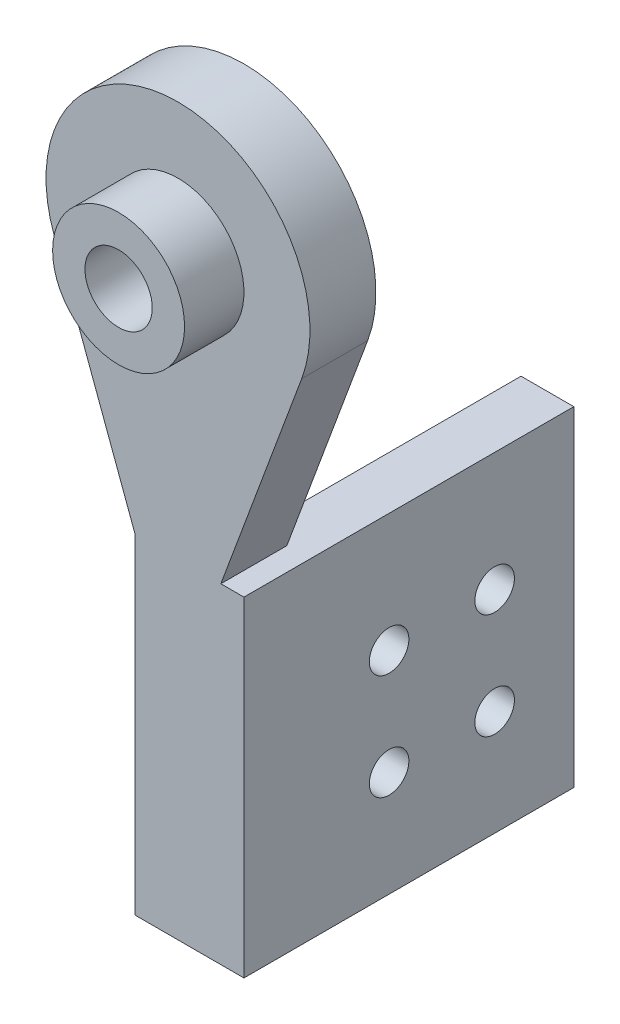
ISO-10303-21;
HEADER;
FILE_DESCRIPTION(('STEP AP214'),'2;1');
FILE_NAME('part.step','',(''),(''),'','','');
FILE_SCHEMA(('AUTOMOTIVE_DESIGN { 1 0 10303 214 1 1 1 1 }'));
ENDSEC;
DATA;
#1=APPLICATION_CONTEXT('core data for automotive mechanical design processes');
#2=APPLICATION_PROTOCOL_DEFINITION('international standard','automotive_design',2000,#1);
#3=PRODUCT_CONTEXT('',#1,'mechanical');
#4=PRODUCT('Part','Part','',(#3));
#5=PRODUCT_RELATED_PRODUCT_CATEGORY('part','',(#4));
#6=PRODUCT_DEFINITION_FORMATION('','',#4);
#7=PRODUCT_DEFINITION_CONTEXT('part definition',#1,'design');
#8=PRODUCT_DEFINITION('design','',#6,#7);
#9=PRODUCT_DEFINITION_SHAPE('','',#8);
#10=(LENGTH_UNIT() NAMED_UNIT(*) SI_UNIT(.MILLI.,.METRE.));
#11=(NAMED_UNIT(*) PLANE_ANGLE_UNIT() SI_UNIT($,.RADIAN.));
#12=(NAMED_UNIT(*) SI_UNIT($,.STERADIAN.) SOLID_ANGLE_UNIT());
#13=UNCERTAINTY_MEASURE_WITH_UNIT(LENGTH_MEASURE(1.E-05),#10,'distance_accuracy_value','');
#14=(GEOMETRIC_REPRESENTATION_CONTEXT(3) GLOBAL_UNCERTAINTY_ASSIGNED_CONTEXT((#13)) GLOBAL_UNIT_ASSIGNED_CONTEXT((#10,
#11,#12)) REPRESENTATION_CONTEXT('',''));
#15=CARTESIAN_POINT('',(0.,0.,0.));
#16=DIRECTION('',(0.,0.,1.));
#17=DIRECTION('',(1.,0.,0.));
#18=AXIS2_PLACEMENT_3D('',#15,#16,#17);
#19=CARTESIAN_POINT('',(0.,0.,5.));
#20=DIRECTION('',(0.,0.,-1.));
#21=DIRECTION('',(-1.,0.,0.));
#22=AXIS2_PLACEMENT_3D('',#19,#20,#21);
#23=PLANE('',#22);
#24=CARTESIAN_POINT('',(-0.331250810167493,32.3880005579145,5.));
#25=DIRECTION('',(0.,0.,-1.));
#26=DIRECTION('',(-1.,0.,0.));
#27=AXIS2_PLACEMENT_3D('',#24,#25,#26);
#28=CIRCLE('',#27,5.);
#29=CARTESIAN_POINT('',(-5.33125081016749,32.3880005579145,5.));
#30=VERTEX_POINT('',#29);
#31=EDGE_CURVE('E12',#30,#30,#28,.F.);
#32=ORIENTED_EDGE('',*,*,#31,.F.);
#33=EDGE_LOOP('',(#32));
#34=FACE_BOUND('',#33,.T.);
#35=DIRECTION('',(0.,1.,0.));
#36=VECTOR('',#35,1.);
#37=CARTESIAN_POINT('',(-3.58115134267295,12.3881145780887,5.));
#38=LINE('',#37,#36);
#39=CARTESIAN_POINT('',(-3.58115134267295,-12.6118854219113,5.));
#40=VERTEX_POINT('',#39);
#41=CARTESIAN_POINT('',(-3.58115134267295,12.3881145780887,5.));
#42=VERTEX_POINT('',#41);
#43=EDGE_CURVE('E141',#40,#42,#38,.T.);
#44=ORIENTED_EDGE('',*,*,#43,.F.);
#45=DIRECTION('',(1.,0.,0.));
#46=VECTOR('',#45,1.);
#47=CARTESIAN_POINT('',(-3.58115134267295,-12.6118854219113,5.));
#48=LINE('',#47,#46);
#49=CARTESIAN_POINT('',(4.6687491898325,-12.6118854219113,5.));
#50=VERTEX_POINT('',#49);
#51=EDGE_CURVE('E182',#40,#50,#48,.T.);
#52=ORIENTED_EDGE('',*,*,#51,.T.);
#53=DIRECTION('',(0.,1.,0.));
#54=VECTOR('',#53,1.);
#55=CARTESIAN_POINT('',(4.6687491898325,12.3881145780887,5.));
#56=LINE('',#55,#54);
#57=CARTESIAN_POINT('',(4.6687491898325,12.3881145780887,5.));
#58=VERTEX_POINT('',#57);
#59=EDGE_CURVE('E185',#50,#58,#56,.T.);
#60=ORIENTED_EDGE('',*,*,#59,.T.);
#61=DIRECTION('',(-1.,0.,0.));
#62=VECTOR('',#61,1.);
#63=CARTESIAN_POINT('',(2.91884865732704,12.3881145780887,5.));
#64=LINE('',#63,#62);
#65=CARTESIAN_POINT('',(2.91884865732704,12.3881145780887,5.));
#66=VERTEX_POINT('',#65);
#67=EDGE_CURVE('E207',#58,#66,#64,.T.);
#68=ORIENTED_EDGE('',*,*,#67,.T.);
#69=DIRECTION('',(-0.347654551948024,-0.937622691976799,0.));
#70=VECTOR('',#69,1.);
#71=CARTESIAN_POINT('',(-1.47207295919862,0.545819623868128,5.));
#72=LINE('',#71,#70);
#73=CARTESIAN_POINT('',(9.04536842146665,28.9113095758647,5.));
#74=VERTEX_POINT('',#73);
#75=EDGE_CURVE('E279',#74,#66,#72,.T.);
#76=ORIENTED_EDGE('',*,*,#75,.F.);
#77=CARTESIAN_POINT('',(-0.331250810167493,32.3880005579145,5.));
#78=DIRECTION('',(0.,0.,1.));
#79=DIRECTION('',(1.,0.,0.));
#80=AXIS2_PLACEMENT_3D('',#77,#78,#79);
#81=CIRCLE('',#80,10.0004184112325);
#82=CARTESIAN_POINT('',(-9.70783324201889,28.911210328635,5.));
#83=VERTEX_POINT('',#82);
#84=EDGE_CURVE('E274',#83,#74,#81,.F.);
#85=ORIENTED_EDGE('',*,*,#84,.F.);
#86=DIRECTION('',(0.347664476255751,-0.937619012152492,0.));
#87=VECTOR('',#86,1.);
#88=CARTESIAN_POINT('',(0.889942756504651,0.32998635728119,5.));
#89=LINE('',#88,#87);
#90=EDGE_CURVE('E287',#83,#42,#89,.T.);
#91=ORIENTED_EDGE('',*,*,#90,.T.);
#92=EDGE_LOOP('',(#44,#52,#60,#68,#76,#85,#91));
#93=FACE_BOUND('',#92,.T.);
#94=ADVANCED_FACE('F101',(#34,#93),#23,.F.);
#95=CARTESIAN_POINT('',(-3.58115134267295,-12.6118854219113,5.));
#96=DIRECTION('',(0.,1.,0.));
#97=DIRECTION('',(0.,0.,1.));
#98=AXIS2_PLACEMENT_3D('',#95,#96,#97);
#99=PLANE('',#98);
#100=DIRECTION('',(0.,0.,1.));
#101=VECTOR('',#100,1.);
#102=CARTESIAN_POINT('',(-3.58115134267295,-12.6118854219113,-20.));
#103=LINE('',#102,#101);
#104=CARTESIAN_POINT('',(-3.58115134267295,-12.6118854219113,0.));
#105=VERTEX_POINT('',#104);
#106=EDGE_CURVE('E210',#105,#40,#103,.T.);
#107=ORIENTED_EDGE('',*,*,#106,.F.);
#108=DIRECTION('',(1.,0.,0.));
#109=VECTOR('',#108,1.);
#110=CARTESIAN_POINT('',(-3.58115134267295,-12.6118854219113,0.));
#111=LINE('',#110,#109);
#112=CARTESIAN_POINT('',(0.668749189832504,-12.6118854219113,0.));
#113=VERTEX_POINT('',#112);
#114=EDGE_CURVE('E191',#105,#113,#111,.T.);
#115=ORIENTED_EDGE('',*,*,#114,.T.);
#116=DIRECTION('',(0.,0.,1.));
#117=VECTOR('',#116,1.);
#118=CARTESIAN_POINT('',(0.668749189832504,-12.6118854219113,-20.));
#119=LINE('',#118,#117);
#120=CARTESIAN_POINT('',(0.668749189832504,-12.6118854219113,-20.));
#121=VERTEX_POINT('',#120);
#122=EDGE_CURVE('E202',#121,#113,#119,.T.);
#123=ORIENTED_EDGE('',*,*,#122,.F.);
#124=DIRECTION('',(-1.,0.,0.));
#125=VECTOR('',#124,1.);
#126=CARTESIAN_POINT('',(0.,-12.6118854219113,-20.));
#127=LINE('',#126,#125);
#128=CARTESIAN_POINT('',(4.6687491898325,-12.6118854219113,-20.));
#129=VERTEX_POINT('',#128);
#130=EDGE_CURVE('E197',#129,#121,#127,.T.);
#131=ORIENTED_EDGE('',*,*,#130,.F.);
#132=DIRECTION('',(0.,0.,1.));
#133=VECTOR('',#132,1.);
#134=CARTESIAN_POINT('',(4.6687491898325,-12.6118854219113,-20.));
#135=LINE('',#134,#133);
#136=EDGE_CURVE('E195',#129,#50,#135,.T.);
#137=ORIENTED_EDGE('',*,*,#136,.T.);
#138=ORIENTED_EDGE('',*,*,#51,.F.);
#139=EDGE_LOOP('',(#107,#115,#123,#131,#137,#138));
#140=FACE_BOUND('',#139,.T.);
#141=ADVANCED_FACE('F103',(#140),#99,.F.);
#142=CARTESIAN_POINT('',(0.,0.,0.));
#143=DIRECTION('',(0.,0.,-1.));
#144=DIRECTION('',(-1.,0.,0.));
#145=AXIS2_PLACEMENT_3D('',#142,#143,#144);
#146=PLANE('',#145);
#147=DIRECTION('',(0.,-1.,0.));
#148=VECTOR('',#147,1.);
#149=CARTESIAN_POINT('',(0.668749189832503,0.,0.));
#150=LINE('',#149,#148);
#151=CARTESIAN_POINT('',(0.668749189832503,12.3881145780887,0.));
#152=VERTEX_POINT('',#151);
#153=EDGE_CURVE('E236',#152,#113,#150,.T.);
#154=ORIENTED_EDGE('',*,*,#153,.T.);
#155=ORIENTED_EDGE('',*,*,#114,.F.);
#156=DIRECTION('',(0.,-1.,0.));
#157=VECTOR('',#156,1.);
#158=CARTESIAN_POINT('',(-3.58115134267295,12.3881145780887,0.));
#159=LINE('',#158,#157);
#160=CARTESIAN_POINT('',(-3.58115134267295,12.3881145780887,0.));
#161=VERTEX_POINT('',#160);
#162=EDGE_CURVE('E296',#161,#105,#159,.T.);
#163=ORIENTED_EDGE('',*,*,#162,.F.);
#164=DIRECTION('',(0.347664476255751,-0.937619012152492,0.));
#165=VECTOR('',#164,1.);
#166=CARTESIAN_POINT('',(0.889942756504651,0.32998635728119,0.));
#167=LINE('',#166,#165);
#168=CARTESIAN_POINT('',(-9.70783324201889,28.911210328635,0.));
#169=VERTEX_POINT('',#168);
#170=EDGE_CURVE('E278',#169,#161,#167,.T.);
#171=ORIENTED_EDGE('',*,*,#170,.F.);
#172=CARTESIAN_POINT('',(-0.331250810167493,32.3880005579145,0.));
#173=DIRECTION('',(0.,0.,1.));
#174=DIRECTION('',(1.,0.,0.));
#175=AXIS2_PLACEMENT_3D('',#172,#173,#174);
#176=CIRCLE('',#175,10.0004184112325);
#177=CARTESIAN_POINT('',(9.04536842146665,28.9113095758647,0.));
#178=VERTEX_POINT('',#177);
#179=EDGE_CURVE('E275',#169,#178,#176,.F.);
#180=ORIENTED_EDGE('',*,*,#179,.T.);
#181=DIRECTION('',(-0.347654551948024,-0.937622691976799,0.));
#182=VECTOR('',#181,1.);
#183=CARTESIAN_POINT('',(-1.47207295919862,0.545819623868128,0.));
#184=LINE('',#183,#182);
#185=CARTESIAN_POINT('',(2.91884865732704,12.3881145780887,0.));
#186=VERTEX_POINT('',#185);
#187=EDGE_CURVE('E121',#178,#186,#184,.T.);
#188=ORIENTED_EDGE('',*,*,#187,.T.);
#189=DIRECTION('',(1.,0.,0.));
#190=VECTOR('',#189,1.);
#191=CARTESIAN_POINT('',(0.,12.3881145780887,0.));
#192=LINE('',#191,#190);
#193=EDGE_CURVE('E242',#152,#186,#192,.T.);
#194=ORIENTED_EDGE('',*,*,#193,.F.);
#195=EDGE_LOOP('',(#154,#155,#163,#171,#180,#188,#194));
#196=FACE_BOUND('',#195,.T.);
#197=CARTESIAN_POINT('',(-0.331250810167493,32.3880005579145,0.));
#198=DIRECTION('',(0.,0.,1.));
#199=DIRECTION('',(1.,0.,0.));
#200=AXIS2_PLACEMENT_3D('',#197,#198,#199);
#201=CIRCLE('',#200,2.55);
#202=CARTESIAN_POINT('',(2.21874918983251,32.3880005579145,0.));
#203=VERTEX_POINT('',#202);
#204=EDGE_CURVE('E270',#203,#203,#201,.T.);
#205=ORIENTED_EDGE('',*,*,#204,.T.);
#206=EDGE_LOOP('',(#205));
#207=FACE_BOUND('',#206,.T.);
#208=ADVANCED_FACE('F343',(#196,#207),#146,.T.);
#209=CARTESIAN_POINT('',(-0.331250810167493,32.3880005579145,0.));
#210=DIRECTION('',(0.,0.,1.));
#211=DIRECTION('',(1.,0.,0.));
#212=AXIS2_PLACEMENT_3D('',#209,#210,#211);
#213=CYLINDRICAL_SURFACE('',#212,10.0004184112325);
#214=ORIENTED_EDGE('',*,*,#84,.T.);
#215=DIRECTION('',(0.,0.,1.));
#216=VECTOR('',#215,1.);
#217=CARTESIAN_POINT('',(9.04536842146665,28.9113095758647,0.));
#218=LINE('',#217,#216);
#219=EDGE_CURVE('E293',#178,#74,#218,.T.);
#220=ORIENTED_EDGE('',*,*,#219,.F.);
#221=ORIENTED_EDGE('',*,*,#179,.F.);
#222=DIRECTION('',(0.,0.,1.));
#223=VECTOR('',#222,1.);
#224=CARTESIAN_POINT('',(-9.70783324201889,28.911210328635,0.));
#225=LINE('',#224,#223);
#226=EDGE_CURVE('E132',#169,#83,#225,.T.);
#227=ORIENTED_EDGE('',*,*,#226,.T.);
#228=EDGE_LOOP('',(#214,#220,#221,#227));
#229=FACE_BOUND('',#228,.T.);
#230=ADVANCED_FACE('F346',(#229),#213,.T.);
#231=CARTESIAN_POINT('',(-1.47207295919862,0.545819623868128,0.));
#232=DIRECTION('',(-0.937622691976799,0.347654551948024,0.));
#233=DIRECTION('',(-0.347654551948024,-0.937622691976799,0.));
#234=AXIS2_PLACEMENT_3D('',#231,#232,#233);
#235=PLANE('',#234);
#236=ORIENTED_EDGE('',*,*,#75,.T.);
#237=DIRECTION('',(0.,0.,-1.));
#238=VECTOR('',#237,1.);
#239=CARTESIAN_POINT('',(2.91884865732704,12.3881145780887,5.));
#240=LINE('',#239,#238);
#241=EDGE_CURVE('E112',#66,#186,#240,.T.);
#242=ORIENTED_EDGE('',*,*,#241,.T.);
#243=ORIENTED_EDGE('',*,*,#187,.F.);
#244=ORIENTED_EDGE('',*,*,#219,.T.);
#245=EDGE_LOOP('',(#236,#242,#243,#244));
#246=FACE_BOUND('',#245,.T.);
#247=ADVANCED_FACE('F353',(#246),#235,.F.);
#248=CARTESIAN_POINT('',(0.889942756504651,0.32998635728119,0.));
#249=DIRECTION('',(-0.937619012152492,-0.34766447625575,0.));
#250=DIRECTION('',(0.34766447625575,-0.937619012152492,0.));
#251=AXIS2_PLACEMENT_3D('',#248,#249,#250);
#252=PLANE('',#251);
#253=ORIENTED_EDGE('',*,*,#90,.F.);
#254=ORIENTED_EDGE('',*,*,#226,.F.);
#255=ORIENTED_EDGE('',*,*,#170,.T.);
#256=DIRECTION('',(0.,0.,1.));
#257=VECTOR('',#256,1.);
#258=CARTESIAN_POINT('',(-3.58115134267295,12.3881145780887,0.));
#259=LINE('',#258,#257);
#260=EDGE_CURVE('E297',#161,#42,#259,.T.);
#261=ORIENTED_EDGE('',*,*,#260,.T.);
#262=EDGE_LOOP('',(#253,#254,#255,#261));
#263=FACE_BOUND('',#262,.T.);
#264=ADVANCED_FACE('F364',(#263),#252,.T.);
#265=CARTESIAN_POINT('',(-0.331250810167493,32.3880005579145,0.));
#266=DIRECTION('',(0.,0.,1.));
#267=DIRECTION('',(1.,0.,0.));
#268=AXIS2_PLACEMENT_3D('',#265,#266,#267);
#269=CYLINDRICAL_SURFACE('',#268,2.55);
#270=ORIENTED_EDGE('',*,*,#204,.F.);
#271=EDGE_LOOP('',(#270));
#272=FACE_BOUND('',#271,.T.);
#273=CARTESIAN_POINT('',(-0.331250810167493,32.3880005579145,9.5));
#274=DIRECTION('',(0.,0.,1.));
#275=DIRECTION('',(1.,0.,0.));
#276=AXIS2_PLACEMENT_3D('',#273,#274,#275);
#277=CIRCLE('',#276,2.55);
#278=CARTESIAN_POINT('',(2.21874918983251,32.3880005579145,9.5));
#279=VERTEX_POINT('',#278);
#280=EDGE_CURVE('E262',#279,#279,#277,.T.);
#281=ORIENTED_EDGE('',*,*,#280,.T.);
#282=EDGE_LOOP('',(#281));
#283=FACE_BOUND('',#282,.T.);
#284=ADVANCED_FACE('F360',(#272,#283),#269,.F.);
#285=CARTESIAN_POINT('',(-0.331250810167493,32.3880005579145,9.5));
#286=DIRECTION('',(0.,0.,1.));
#287=DIRECTION('',(1.,0.,0.));
#288=AXIS2_PLACEMENT_3D('',#285,#286,#287);
#289=PLANE('',#288);
#290=CARTESIAN_POINT('',(-0.331250810167493,32.3880005579145,9.5));
#291=DIRECTION('',(0.,0.,1.));
#292=DIRECTION('',(1.,0.,0.));
#293=AXIS2_PLACEMENT_3D('',#290,#291,#292);
#294=CIRCLE('',#293,5.);
#295=CARTESIAN_POINT('',(4.66874918983251,32.3880005579145,9.5));
#296=VERTEX_POINT('',#295);
#297=EDGE_CURVE('E266',#296,#296,#294,.T.);
#298=ORIENTED_EDGE('',*,*,#297,.T.);
#299=EDGE_LOOP('',(#298));
#300=FACE_BOUND('',#299,.T.);
#301=ORIENTED_EDGE('',*,*,#280,.F.);
#302=EDGE_LOOP('',(#301));
#303=FACE_BOUND('',#302,.T.);
#304=ADVANCED_FACE('F363',(#300,#303),#289,.T.);
#305=CARTESIAN_POINT('',(-0.331250810167493,32.3880005579145,9.5));
#306=DIRECTION('',(0.,0.,-1.));
#307=DIRECTION('',(-1.,0.,0.));
#308=AXIS2_PLACEMENT_3D('',#305,#306,#307);
#309=CYLINDRICAL_SURFACE('',#308,5.);
#310=ORIENTED_EDGE('',*,*,#297,.F.);
#311=EDGE_LOOP('',(#310));
#312=FACE_BOUND('',#311,.T.);
#313=ORIENTED_EDGE('',*,*,#31,.T.);
#314=EDGE_LOOP('',(#313));
#315=FACE_BOUND('',#314,.T.);
#316=ADVANCED_FACE('F369',(#312,#315),#309,.T.);
#317=CARTESIAN_POINT('',(0.668749189832503,0.,-20.));
#318=DIRECTION('',(-1.,0.,0.));
#319=DIRECTION('',(0.,-1.,0.));
#320=AXIS2_PLACEMENT_3D('',#317,#318,#319);
#321=PLANE('',#320);
#322=CARTESIAN_POINT('',(0.668749189832504,3.38811457808874,-6.));
#323=DIRECTION('',(-1.,0.,0.));
#324=DIRECTION('',(0.,-1.,0.));
#325=AXIS2_PLACEMENT_3D('',#322,#323,#324);
#326=CIRCLE('',#325,1.5);
#327=CARTESIAN_POINT('',(0.668749189832504,1.88811457808874,-6.));
#328=VERTEX_POINT('',#327);
#329=EDGE_CURVE('E232',#328,#328,#326,.T.);
#330=ORIENTED_EDGE('',*,*,#329,.F.);
#331=EDGE_LOOP('',(#330));
#332=FACE_BOUND('',#331,.T.);
#333=CARTESIAN_POINT('',(0.668749189832504,-4.61188542191126,-14.));
#334=DIRECTION('',(-1.,0.,0.));
#335=DIRECTION('',(0.,-1.,0.));
#336=AXIS2_PLACEMENT_3D('',#333,#334,#335);
#337=CIRCLE('',#336,1.5);
#338=CARTESIAN_POINT('',(0.668749189832504,-6.11188542191126,-14.));
#339=VERTEX_POINT('',#338);
#340=EDGE_CURVE('E228',#339,#339,#337,.T.);
#341=ORIENTED_EDGE('',*,*,#340,.F.);
#342=EDGE_LOOP('',(#341));
#343=FACE_BOUND('',#342,.T.);
#344=CARTESIAN_POINT('',(0.668749189832504,-4.61188542191126,-6.));
#345=DIRECTION('',(-1.,0.,0.));
#346=DIRECTION('',(0.,-1.,0.));
#347=AXIS2_PLACEMENT_3D('',#344,#345,#346);
#348=CIRCLE('',#347,1.5);
#349=CARTESIAN_POINT('',(0.668749189832504,-6.11188542191126,-6.));
#350=VERTEX_POINT('',#349);
#351=EDGE_CURVE('E223',#350,#350,#348,.T.);
#352=ORIENTED_EDGE('',*,*,#351,.F.);
#353=EDGE_LOOP('',(#352));
#354=FACE_BOUND('',#353,.T.);
#355=CARTESIAN_POINT('',(0.668749189832504,3.38811457808874,-14.));
#356=DIRECTION('',(-1.,0.,0.));
#357=DIRECTION('',(0.,-1.,0.));
#358=AXIS2_PLACEMENT_3D('',#355,#356,#357);
#359=CIRCLE('',#358,1.5);
#360=CARTESIAN_POINT('',(0.668749189832504,1.88811457808874,-14.));
#361=VERTEX_POINT('',#360);
#362=EDGE_CURVE('E218',#361,#361,#359,.T.);
#363=ORIENTED_EDGE('',*,*,#362,.F.);
#364=EDGE_LOOP('',(#363));
#365=FACE_BOUND('',#364,.T.);
#366=ORIENTED_EDGE('',*,*,#153,.F.);
#367=DIRECTION('',(0.,0.,1.));
#368=VECTOR('',#367,1.);
#369=CARTESIAN_POINT('',(0.668749189832503,12.3881145780887,-20.));
#370=LINE('',#369,#368);
#371=CARTESIAN_POINT('',(0.668749189832503,12.3881145780887,-20.));
#372=VERTEX_POINT('',#371);
#373=EDGE_CURVE('E259',#372,#152,#370,.T.);
#374=ORIENTED_EDGE('',*,*,#373,.F.);
#375=DIRECTION('',(0.,-1.,0.));
#376=VECTOR('',#375,1.);
#377=CARTESIAN_POINT('',(0.668749189832503,0.,-20.));
#378=LINE('',#377,#376);
#379=EDGE_CURVE('E237',#372,#121,#378,.T.);
#380=ORIENTED_EDGE('',*,*,#379,.T.);
#381=ORIENTED_EDGE('',*,*,#122,.T.);
#382=EDGE_LOOP('',(#366,#374,#380,#381));
#383=FACE_BOUND('',#382,.T.);
#384=ADVANCED_FACE('F375',(#332,#343,#354,#365,#383),#321,.T.);
#385=CARTESIAN_POINT('',(0.,12.3881145780887,-20.));
#386=DIRECTION('',(0.,-1.,0.));
#387=DIRECTION('',(0.,0.,-1.));
#388=AXIS2_PLACEMENT_3D('',#385,#386,#387);
#389=PLANE('',#388);
#390=ORIENTED_EDGE('',*,*,#193,.T.);
#391=ORIENTED_EDGE('',*,*,#241,.F.);
#392=ORIENTED_EDGE('',*,*,#67,.F.);
#393=DIRECTION('',(0.,0.,1.));
#394=VECTOR('',#393,1.);
#395=CARTESIAN_POINT('',(4.6687491898325,12.3881145780887,-20.));
#396=LINE('',#395,#394);
#397=CARTESIAN_POINT('',(4.6687491898325,12.3881145780887,-20.));
#398=VERTEX_POINT('',#397);
#399=EDGE_CURVE('E201',#398,#58,#396,.T.);
#400=ORIENTED_EDGE('',*,*,#399,.F.);
#401=DIRECTION('',(1.,0.,0.));
#402=VECTOR('',#401,1.);
#403=CARTESIAN_POINT('',(0.,12.3881145780887,-20.));
#404=LINE('',#403,#402);
#405=EDGE_CURVE('E241',#372,#398,#404,.T.);
#406=ORIENTED_EDGE('',*,*,#405,.F.);
#407=ORIENTED_EDGE('',*,*,#373,.T.);
#408=EDGE_LOOP('',(#390,#391,#392,#400,#406,#407));
#409=FACE_BOUND('',#408,.T.);
#410=ADVANCED_FACE('F391',(#409),#389,.F.);
#411=CARTESIAN_POINT('',(4.6687491898325,0.,-20.));
#412=DIRECTION('',(-1.,0.,0.));
#413=DIRECTION('',(0.,0.,1.));
#414=AXIS2_PLACEMENT_3D('',#411,#412,#413);
#415=PLANE('',#414);
#416=CARTESIAN_POINT('',(4.6687491898325,3.38811457808874,-6.));
#417=DIRECTION('',(-1.,0.,0.));
#418=DIRECTION('',(0.,0.,1.));
#419=AXIS2_PLACEMENT_3D('',#416,#417,#418);
#420=CIRCLE('',#419,1.5);
#421=CARTESIAN_POINT('',(4.6687491898325,3.38811457808874,-4.5));
#422=VERTEX_POINT('',#421);
#423=EDGE_CURVE('E105',#422,#422,#420,.T.);
#424=ORIENTED_EDGE('',*,*,#423,.T.);
#425=EDGE_LOOP('',(#424));
#426=FACE_BOUND('',#425,.T.);
#427=CARTESIAN_POINT('',(4.6687491898325,-4.61188542191126,-14.));
#428=DIRECTION('',(-1.,0.,0.));
#429=DIRECTION('',(0.,0.,1.));
#430=AXIS2_PLACEMENT_3D('',#427,#428,#429);
#431=CIRCLE('',#430,1.5);
#432=CARTESIAN_POINT('',(4.6687491898325,-4.61188542191126,-12.5));
#433=VERTEX_POINT('',#432);
#434=EDGE_CURVE('E227',#433,#433,#431,.T.);
#435=ORIENTED_EDGE('',*,*,#434,.T.);
#436=EDGE_LOOP('',(#435));
#437=FACE_BOUND('',#436,.T.);
#438=CARTESIAN_POINT('',(4.6687491898325,-4.61188542191126,-6.));
#439=DIRECTION('',(-1.,0.,0.));
#440=DIRECTION('',(0.,0.,1.));
#441=AXIS2_PLACEMENT_3D('',#438,#439,#440);
#442=CIRCLE('',#441,1.5);
#443=CARTESIAN_POINT('',(4.6687491898325,-4.61188542191126,-4.5));
#444=VERTEX_POINT('',#443);
#445=EDGE_CURVE('E222',#444,#444,#442,.T.);
#446=ORIENTED_EDGE('',*,*,#445,.T.);
#447=EDGE_LOOP('',(#446));
#448=FACE_BOUND('',#447,.T.);
#449=CARTESIAN_POINT('',(4.6687491898325,3.38811457808874,-14.));
#450=DIRECTION('',(-1.,0.,0.));
#451=DIRECTION('',(0.,0.,1.));
#452=AXIS2_PLACEMENT_3D('',#449,#450,#451);
#453=CIRCLE('',#452,1.5);
#454=CARTESIAN_POINT('',(4.6687491898325,3.38811457808874,-12.5));
#455=VERTEX_POINT('',#454);
#456=EDGE_CURVE('E217',#455,#455,#453,.T.);
#457=ORIENTED_EDGE('',*,*,#456,.T.);
#458=EDGE_LOOP('',(#457));
#459=FACE_BOUND('',#458,.T.);
#460=ORIENTED_EDGE('',*,*,#399,.T.);
#461=ORIENTED_EDGE('',*,*,#59,.F.);
#462=ORIENTED_EDGE('',*,*,#136,.F.);
#463=DIRECTION('',(0.,-1.,0.));
#464=VECTOR('',#463,1.);
#465=CARTESIAN_POINT('',(4.6687491898325,0.,-20.));
#466=LINE('',#465,#464);
#467=EDGE_CURVE('E245',#398,#129,#466,.T.);
#468=ORIENTED_EDGE('',*,*,#467,.F.);
#469=EDGE_LOOP('',(#460,#461,#462,#468));
#470=FACE_BOUND('',#469,.T.);
#471=ADVANCED_FACE('F204',(#426,#437,#448,#459,#470),#415,.F.);
#472=CARTESIAN_POINT('',(0.,0.,-20.));
#473=DIRECTION('',(0.,0.,-1.));
#474=DIRECTION('',(-1.,0.,0.));
#475=AXIS2_PLACEMENT_3D('',#472,#473,#474);
#476=PLANE('',#475);
#477=ORIENTED_EDGE('',*,*,#379,.F.);
#478=ORIENTED_EDGE('',*,*,#405,.T.);
#479=ORIENTED_EDGE('',*,*,#467,.T.);
#480=ORIENTED_EDGE('',*,*,#130,.T.);
#481=EDGE_LOOP('',(#477,#478,#479,#480));
#482=FACE_BOUND('',#481,.T.);
#483=ADVANCED_FACE('F397',(#482),#476,.T.);
#484=CARTESIAN_POINT('',(12.418848657327,3.38811457808874,-14.));
#485=DIRECTION('',(-1.,0.,0.));
#486=DIRECTION('',(0.,0.,1.));
#487=AXIS2_PLACEMENT_3D('',#484,#485,#486);
#488=CYLINDRICAL_SURFACE('',#487,1.5);
#489=ORIENTED_EDGE('',*,*,#362,.T.);
#490=EDGE_LOOP('',(#489));
#491=FACE_BOUND('',#490,.T.);
#492=ORIENTED_EDGE('',*,*,#456,.F.);
#493=EDGE_LOOP('',(#492));
#494=FACE_BOUND('',#493,.T.);
#495=ADVANCED_FACE('F333',(#491,#494),#488,.F.);
#496=CARTESIAN_POINT('',(12.418848657327,-4.61188542191126,-6.));
#497=DIRECTION('',(-1.,0.,0.));
#498=DIRECTION('',(0.,0.,1.));
#499=AXIS2_PLACEMENT_3D('',#496,#497,#498);
#500=CYLINDRICAL_SURFACE('',#499,1.5);
#501=ORIENTED_EDGE('',*,*,#351,.T.);
#502=EDGE_LOOP('',(#501));
#503=FACE_BOUND('',#502,.T.);
#504=ORIENTED_EDGE('',*,*,#445,.F.);
#505=EDGE_LOOP('',(#504));
#506=FACE_BOUND('',#505,.T.);
#507=ADVANCED_FACE('F323',(#503,#506),#500,.F.);
#508=CARTESIAN_POINT('',(12.418848657327,-4.61188542191126,-14.));
#509=DIRECTION('',(-1.,0.,0.));
#510=DIRECTION('',(0.,0.,1.));
#511=AXIS2_PLACEMENT_3D('',#508,#509,#510);
#512=CYLINDRICAL_SURFACE('',#511,1.5);
#513=ORIENTED_EDGE('',*,*,#340,.T.);
#514=EDGE_LOOP('',(#513));
#515=FACE_BOUND('',#514,.T.);
#516=ORIENTED_EDGE('',*,*,#434,.F.);
#517=EDGE_LOOP('',(#516));
#518=FACE_BOUND('',#517,.T.);
#519=ADVANCED_FACE('F320',(#515,#518),#512,.F.);
#520=CARTESIAN_POINT('',(12.418848657327,3.38811457808874,-6.));
#521=DIRECTION('',(-1.,0.,0.));
#522=DIRECTION('',(0.,0.,1.));
#523=AXIS2_PLACEMENT_3D('',#520,#521,#522);
#524=CYLINDRICAL_SURFACE('',#523,1.5);
#525=ORIENTED_EDGE('',*,*,#329,.T.);
#526=EDGE_LOOP('',(#525));
#527=FACE_BOUND('',#526,.T.);
#528=ORIENTED_EDGE('',*,*,#423,.F.);
#529=EDGE_LOOP('',(#528));
#530=FACE_BOUND('',#529,.T.);
#531=ADVANCED_FACE('F322',(#527,#530),#524,.F.);
#532=CARTESIAN_POINT('',(-3.58115134267295,0.,0.));
#533=DIRECTION('',(-1.,0.,0.));
#534=DIRECTION('',(0.,0.,1.));
#535=AXIS2_PLACEMENT_3D('',#532,#533,#534);
#536=PLANE('',#535);
#537=ORIENTED_EDGE('',*,*,#106,.T.);
#538=ORIENTED_EDGE('',*,*,#43,.T.);
#539=ORIENTED_EDGE('',*,*,#260,.F.);
#540=ORIENTED_EDGE('',*,*,#162,.T.);
#541=EDGE_LOOP('',(#537,#538,#539,#540));
#542=FACE_BOUND('',#541,.T.);
#543=ADVANCED_FACE('F330',(#542),#536,.T.);
#544=CLOSED_SHELL('',(#94,#141,#208,#230,#247,#264,#284,#304,#316,#384,#410,#471,#483,#495,#507,
#519,#531,#543));
#545=MANIFOLD_SOLID_BREP('B2',#544);
#546=ADVANCED_BREP_SHAPE_REPRESENTATION('',(#18,#545),#14);
#547=SHAPE_DEFINITION_REPRESENTATION(#9,#546);
ENDSEC;
END-ISO-10303-21;
